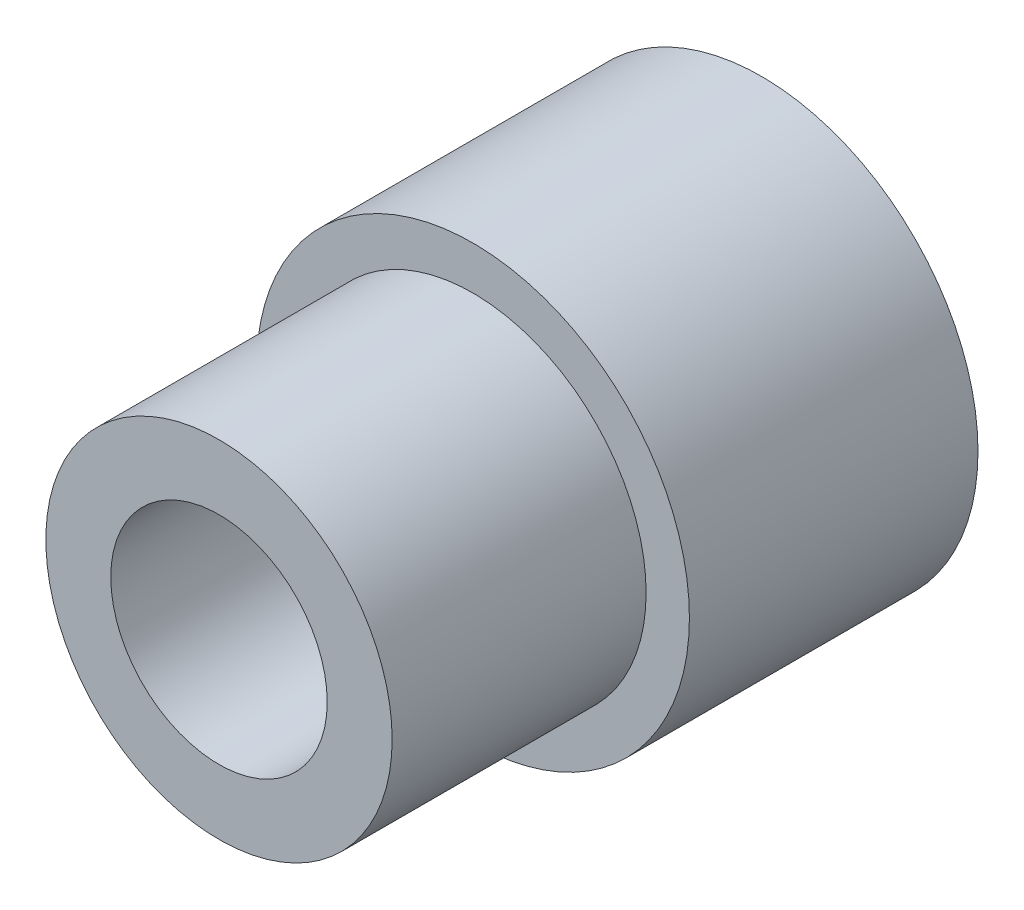
ISO-10303-21;
HEADER;
FILE_DESCRIPTION(('STEP AP214'),'2;1');
FILE_NAME('part.step','',(''),(''),'','','');
FILE_SCHEMA(('AUTOMOTIVE_DESIGN { 1 0 10303 214 1 1 1 1 }'));
ENDSEC;
DATA;
#1=APPLICATION_CONTEXT('core data for automotive mechanical design processes');
#2=APPLICATION_PROTOCOL_DEFINITION('international standard','automotive_design',2000,#1);
#3=PRODUCT_CONTEXT('',#1,'mechanical');
#4=PRODUCT('Part','Part','',(#3));
#5=PRODUCT_RELATED_PRODUCT_CATEGORY('part','',(#4));
#6=PRODUCT_DEFINITION_FORMATION('','',#4);
#7=PRODUCT_DEFINITION_CONTEXT('part definition',#1,'design');
#8=PRODUCT_DEFINITION('design','',#6,#7);
#9=PRODUCT_DEFINITION_SHAPE('','',#8);
#10=(LENGTH_UNIT() NAMED_UNIT(*) SI_UNIT(.MILLI.,.METRE.));
#11=(NAMED_UNIT(*) PLANE_ANGLE_UNIT() SI_UNIT($,.RADIAN.));
#12=(NAMED_UNIT(*) SI_UNIT($,.STERADIAN.) SOLID_ANGLE_UNIT());
#13=UNCERTAINTY_MEASURE_WITH_UNIT(LENGTH_MEASURE(1.E-05),#10,'distance_accuracy_value','');
#14=(GEOMETRIC_REPRESENTATION_CONTEXT(3) GLOBAL_UNCERTAINTY_ASSIGNED_CONTEXT((#13)) GLOBAL_UNIT_ASSIGNED_CONTEXT((#10,
#11,#12)) REPRESENTATION_CONTEXT('',''));
#15=CARTESIAN_POINT('',(0.,0.,0.));
#16=DIRECTION('',(0.,0.,1.));
#17=DIRECTION('',(1.,0.,0.));
#18=AXIS2_PLACEMENT_3D('',#15,#16,#17);
#19=CARTESIAN_POINT('',(0.,0.,12.7));
#20=DIRECTION('',(0.,0.,1.));
#21=DIRECTION('',(1.,0.,0.));
#22=AXIS2_PLACEMENT_3D('',#19,#20,#21);
#23=PLANE('',#22);
#24=CARTESIAN_POINT('',(0.,0.,12.7));
#25=DIRECTION('',(0.,0.,1.));
#26=DIRECTION('',(1.,0.,0.));
#27=AXIS2_PLACEMENT_3D('',#24,#25,#26);
#28=CIRCLE('',#27,9.525);
#29=CARTESIAN_POINT('',(9.525,0.,12.7));
#30=VERTEX_POINT('',#29);
#31=EDGE_CURVE('E10',#30,#30,#28,.T.);
#32=ORIENTED_EDGE('',*,*,#31,.T.);
#33=EDGE_LOOP('',(#32));
#34=FACE_BOUND('',#33,.T.);
#35=CARTESIAN_POINT('',(0.,0.,12.7));
#36=DIRECTION('',(0.,0.,1.));
#37=DIRECTION('',(1.,0.,0.));
#38=AXIS2_PLACEMENT_3D('',#35,#36,#37);
#39=CIRCLE('',#38,7.62);
#40=CARTESIAN_POINT('',(7.62,0.,12.7));
#41=VERTEX_POINT('',#40);
#42=EDGE_CURVE('E46',#41,#41,#39,.T.);
#43=ORIENTED_EDGE('',*,*,#42,.F.);
#44=EDGE_LOOP('',(#43));
#45=FACE_BOUND('',#44,.T.);
#46=ADVANCED_FACE('F33',(#34,#45),#23,.T.);
#47=CARTESIAN_POINT('',(0.,0.,12.7));
#48=DIRECTION('',(0.,0.,-1.));
#49=DIRECTION('',(-1.,0.,0.));
#50=AXIS2_PLACEMENT_3D('',#47,#48,#49);
#51=CYLINDRICAL_SURFACE('',#50,9.525);
#52=ORIENTED_EDGE('',*,*,#31,.F.);
#53=EDGE_LOOP('',(#52));
#54=FACE_BOUND('',#53,.T.);
#55=CARTESIAN_POINT('',(0.,0.,0.));
#56=DIRECTION('',(0.,0.,1.));
#57=DIRECTION('',(1.,0.,0.));
#58=AXIS2_PLACEMENT_3D('',#55,#56,#57);
#59=CIRCLE('',#58,9.525);
#60=CARTESIAN_POINT('',(9.525,0.,0.));
#61=VERTEX_POINT('',#60);
#62=EDGE_CURVE('E37',#61,#61,#59,.T.);
#63=ORIENTED_EDGE('',*,*,#62,.T.);
#64=EDGE_LOOP('',(#63));
#65=FACE_BOUND('',#64,.T.);
#66=ADVANCED_FACE('F35',(#54,#65),#51,.T.);
#67=CARTESIAN_POINT('',(0.,0.,0.));
#68=DIRECTION('',(0.,0.,1.));
#69=DIRECTION('',(1.,0.,0.));
#70=AXIS2_PLACEMENT_3D('',#67,#68,#69);
#71=PLANE('',#70);
#72=CARTESIAN_POINT('',(0.,0.,0.));
#73=DIRECTION('',(0.,0.,1.));
#74=DIRECTION('',(1.,0.,0.));
#75=AXIS2_PLACEMENT_3D('',#72,#73,#74);
#76=CIRCLE('',#75,4.7625);
#77=CARTESIAN_POINT('',(4.7625,0.,0.));
#78=VERTEX_POINT('',#77);
#79=EDGE_CURVE('E49',#78,#78,#76,.T.);
#80=ORIENTED_EDGE('',*,*,#79,.T.);
#81=EDGE_LOOP('',(#80));
#82=FACE_BOUND('',#81,.T.);
#83=ORIENTED_EDGE('',*,*,#62,.F.);
#84=EDGE_LOOP('',(#83));
#85=FACE_BOUND('',#84,.T.);
#86=ADVANCED_FACE('F58',(#82,#85),#71,.F.);
#87=CARTESIAN_POINT('',(0.,0.,23.876));
#88=DIRECTION('',(0.,0.,-1.));
#89=DIRECTION('',(-1.,0.,0.));
#90=AXIS2_PLACEMENT_3D('',#87,#88,#89);
#91=CYLINDRICAL_SURFACE('',#90,7.62);
#92=CARTESIAN_POINT('',(0.,0.,23.876));
#93=DIRECTION('',(0.,0.,1.));
#94=DIRECTION('',(1.,0.,0.));
#95=AXIS2_PLACEMENT_3D('',#92,#93,#94);
#96=CIRCLE('',#95,7.62);
#97=CARTESIAN_POINT('',(7.62,0.,23.876));
#98=VERTEX_POINT('',#97);
#99=EDGE_CURVE('E44',#98,#98,#96,.T.);
#100=ORIENTED_EDGE('',*,*,#99,.F.);
#101=EDGE_LOOP('',(#100));
#102=FACE_BOUND('',#101,.T.);
#103=ORIENTED_EDGE('',*,*,#42,.T.);
#104=EDGE_LOOP('',(#103));
#105=FACE_BOUND('',#104,.T.);
#106=ADVANCED_FACE('F70',(#102,#105),#91,.T.);
#107=CARTESIAN_POINT('',(0.,0.,23.876));
#108=DIRECTION('',(0.,0.,1.));
#109=DIRECTION('',(1.,0.,0.));
#110=AXIS2_PLACEMENT_3D('',#107,#108,#109);
#111=PLANE('',#110);
#112=CARTESIAN_POINT('',(0.,0.,23.876));
#113=DIRECTION('',(0.,0.,1.));
#114=DIRECTION('',(1.,0.,0.));
#115=AXIS2_PLACEMENT_3D('',#112,#113,#114);
#116=CIRCLE('',#115,4.7625);
#117=CARTESIAN_POINT('',(4.7625,0.,23.876));
#118=VERTEX_POINT('',#117);
#119=EDGE_CURVE('E52',#118,#118,#116,.T.);
#120=ORIENTED_EDGE('',*,*,#119,.F.);
#121=EDGE_LOOP('',(#120));
#122=FACE_BOUND('',#121,.T.);
#123=ORIENTED_EDGE('',*,*,#99,.T.);
#124=EDGE_LOOP('',(#123));
#125=FACE_BOUND('',#124,.T.);
#126=ADVANCED_FACE('F64',(#122,#125),#111,.T.);
#127=CARTESIAN_POINT('',(0.,0.,0.));
#128=DIRECTION('',(0.,0.,1.));
#129=DIRECTION('',(1.,0.,0.));
#130=AXIS2_PLACEMENT_3D('',#127,#128,#129);
#131=CYLINDRICAL_SURFACE('',#130,4.7625);
#132=ORIENTED_EDGE('',*,*,#79,.F.);
#133=EDGE_LOOP('',(#132));
#134=FACE_BOUND('',#133,.T.);
#135=ORIENTED_EDGE('',*,*,#119,.T.);
#136=EDGE_LOOP('',(#135));
#137=FACE_BOUND('',#136,.T.);
#138=ADVANCED_FACE('F61',(#134,#137),#131,.F.);
#139=CLOSED_SHELL('',(#46,#66,#86,#106,#126,#138));
#140=MANIFOLD_SOLID_BREP('B2',#139);
#141=ADVANCED_BREP_SHAPE_REPRESENTATION('',(#18,#140),#14);
#142=SHAPE_DEFINITION_REPRESENTATION(#9,#141);
ENDSEC;
END-ISO-10303-21;
